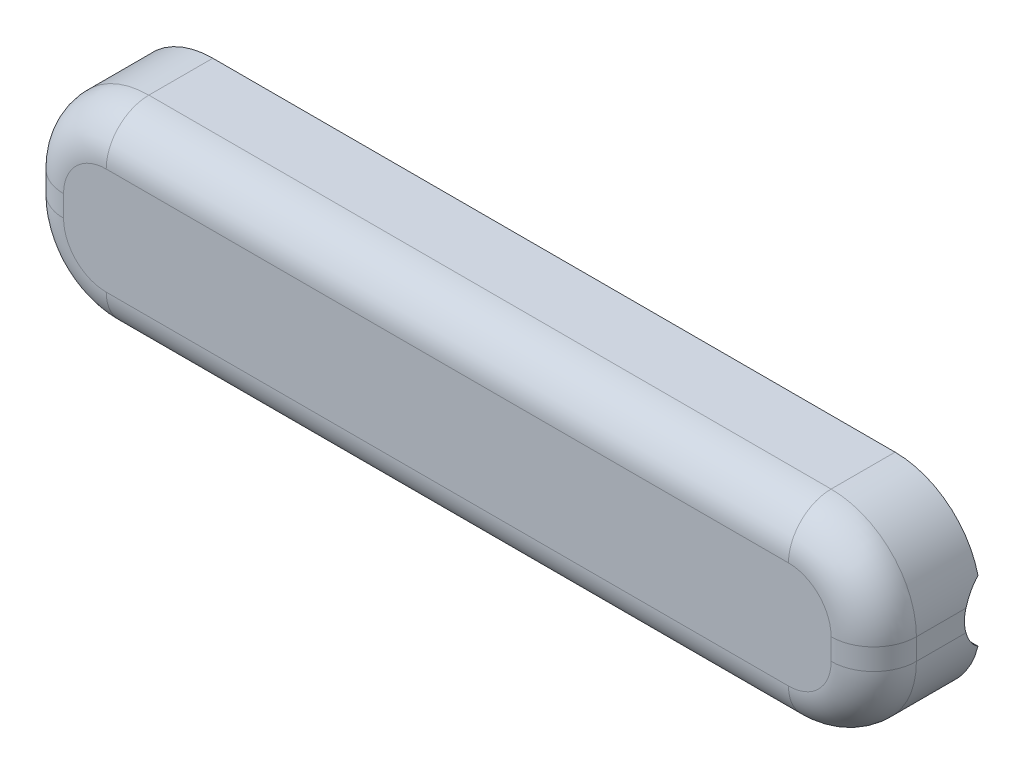
ISO-10303-21;
HEADER;
FILE_DESCRIPTION(('STEP AP214'),'2;1');
FILE_NAME('part.step','',(''),(''),'','','');
FILE_SCHEMA(('AUTOMOTIVE_DESIGN { 1 0 10303 214 1 1 1 1 }'));
ENDSEC;
DATA;
#1=APPLICATION_CONTEXT('core data for automotive mechanical design processes');
#2=APPLICATION_PROTOCOL_DEFINITION('international standard','automotive_design',2000,#1);
#3=PRODUCT_CONTEXT('',#1,'mechanical');
#4=PRODUCT('Part','Part','',(#3));
#5=PRODUCT_RELATED_PRODUCT_CATEGORY('part','',(#4));
#6=PRODUCT_DEFINITION_FORMATION('','',#4);
#7=PRODUCT_DEFINITION_CONTEXT('part definition',#1,'design');
#8=PRODUCT_DEFINITION('design','',#6,#7);
#9=PRODUCT_DEFINITION_SHAPE('','',#8);
#10=(LENGTH_UNIT() NAMED_UNIT(*) SI_UNIT(.MILLI.,.METRE.));
#11=(NAMED_UNIT(*) PLANE_ANGLE_UNIT() SI_UNIT($,.RADIAN.));
#12=(NAMED_UNIT(*) SI_UNIT($,.STERADIAN.) SOLID_ANGLE_UNIT());
#13=UNCERTAINTY_MEASURE_WITH_UNIT(LENGTH_MEASURE(1.E-05),#10,'distance_accuracy_value','');
#14=(GEOMETRIC_REPRESENTATION_CONTEXT(3) GLOBAL_UNCERTAINTY_ASSIGNED_CONTEXT((#13)) GLOBAL_UNIT_ASSIGNED_CONTEXT((#10,
#11,#12)) REPRESENTATION_CONTEXT('',''));
#15=CARTESIAN_POINT('',(0.,0.,0.));
#16=DIRECTION('',(0.,0.,1.));
#17=DIRECTION('',(1.,0.,0.));
#18=AXIS2_PLACEMENT_3D('',#15,#16,#17);
#19=CARTESIAN_POINT('',(0.,0.,0.));
#20=DIRECTION('',(0.,0.,1.));
#21=DIRECTION('',(1.,0.,0.));
#22=AXIS2_PLACEMENT_3D('',#19,#20,#21);
#23=PLANE('',#22);
#24=CARTESIAN_POINT('',(-101.6,-3.175,0.));
#25=DIRECTION('',(0.,0.,1.));
#26=DIRECTION('',(1.,0.,0.));
#27=AXIS2_PLACEMENT_3D('',#24,#25,#26);
#28=CIRCLE('',#27,25.4);
#29=CARTESIAN_POINT('',(-101.6,-28.575,0.));
#30=VERTEX_POINT('',#29);
#31=CARTESIAN_POINT('',(-126.294594561943,-9.11949320137913,0.));
#32=VERTEX_POINT('',#31);
#33=EDGE_CURVE('E268',#30,#32,#28,.F.);
#34=ORIENTED_EDGE('',*,*,#33,.T.);
#35=DIRECTION('',(1.,0.,0.));
#36=VECTOR('',#35,1.);
#37=CARTESIAN_POINT('',(-127.,-9.11949320137913,0.));
#38=LINE('',#37,#36);
#39=CARTESIAN_POINT('',(126.294594561943,-9.11949320137913,0.));
#40=VERTEX_POINT('',#39);
#41=EDGE_CURVE('E190',#32,#40,#38,.T.);
#42=ORIENTED_EDGE('',*,*,#41,.T.);
#43=CARTESIAN_POINT('',(101.6,-3.175,0.));
#44=DIRECTION('',(0.,0.,1.));
#45=DIRECTION('',(1.,0.,0.));
#46=AXIS2_PLACEMENT_3D('',#43,#44,#45);
#47=CIRCLE('',#46,25.4);
#48=CARTESIAN_POINT('',(101.6,-28.575,0.));
#49=VERTEX_POINT('',#48);
#50=EDGE_CURVE('E66',#40,#49,#47,.F.);
#51=ORIENTED_EDGE('',*,*,#50,.T.);
#52=DIRECTION('',(1.,0.,0.));
#53=VECTOR('',#52,1.);
#54=CARTESIAN_POINT('',(-127.,-28.575,0.));
#55=LINE('',#54,#53);
#56=EDGE_CURVE('E328',#30,#49,#55,.T.);
#57=ORIENTED_EDGE('',*,*,#56,.F.);
#58=EDGE_LOOP('',(#34,#42,#51,#57));
#59=FACE_BOUND('',#58,.T.);
#60=ADVANCED_FACE('F38',(#59),#23,.F.);
#61=CARTESIAN_POINT('',(0.,0.,31.75));
#62=DIRECTION('',(0.,0.,1.));
#63=DIRECTION('',(1.,0.,0.));
#64=AXIS2_PLACEMENT_3D('',#61,#62,#63);
#65=PLANE('',#64);
#66=CARTESIAN_POINT('',(-101.6,3.175,31.75));
#67=DIRECTION('',(0.,0.,1.));
#68=DIRECTION('',(1.,0.,0.));
#69=AXIS2_PLACEMENT_3D('',#66,#67,#68);
#70=CIRCLE('',#69,12.7);
#71=CARTESIAN_POINT('',(-114.3,3.175,31.75));
#72=VERTEX_POINT('',#71);
#73=CARTESIAN_POINT('',(-101.6,15.875,31.75));
#74=VERTEX_POINT('',#73);
#75=EDGE_CURVE('E296',#72,#74,#70,.F.);
#76=ORIENTED_EDGE('',*,*,#75,.F.);
#77=DIRECTION('',(0.,-1.,0.));
#78=VECTOR('',#77,1.);
#79=CARTESIAN_POINT('',(-114.3,-28.575,31.75));
#80=LINE('',#79,#78);
#81=CARTESIAN_POINT('',(-114.3,-3.17500000000001,31.75));
#82=VERTEX_POINT('',#81);
#83=EDGE_CURVE('E326',#72,#82,#80,.T.);
#84=ORIENTED_EDGE('',*,*,#83,.T.);
#85=CARTESIAN_POINT('',(-101.6,-3.175,31.75));
#86=DIRECTION('',(0.,0.,1.));
#87=DIRECTION('',(1.,0.,0.));
#88=AXIS2_PLACEMENT_3D('',#85,#86,#87);
#89=CIRCLE('',#88,12.7);
#90=CARTESIAN_POINT('',(-101.6,-15.875,31.75));
#91=VERTEX_POINT('',#90);
#92=EDGE_CURVE('E299',#91,#82,#89,.F.);
#93=ORIENTED_EDGE('',*,*,#92,.F.);
#94=DIRECTION('',(1.,0.,0.));
#95=VECTOR('',#94,1.);
#96=CARTESIAN_POINT('',(127.,-15.875,31.75));
#97=LINE('',#96,#95);
#98=CARTESIAN_POINT('',(101.6,-15.875,31.75));
#99=VERTEX_POINT('',#98);
#100=EDGE_CURVE('E320',#91,#99,#97,.T.);
#101=ORIENTED_EDGE('',*,*,#100,.T.);
#102=CARTESIAN_POINT('',(101.6,-3.175,31.75));
#103=DIRECTION('',(0.,0.,1.));
#104=DIRECTION('',(1.,0.,0.));
#105=AXIS2_PLACEMENT_3D('',#102,#103,#104);
#106=CIRCLE('',#105,12.7);
#107=CARTESIAN_POINT('',(114.3,-3.175,31.75));
#108=VERTEX_POINT('',#107);
#109=EDGE_CURVE('E301',#108,#99,#106,.F.);
#110=ORIENTED_EDGE('',*,*,#109,.F.);
#111=DIRECTION('',(0.,1.,0.));
#112=VECTOR('',#111,1.);
#113=CARTESIAN_POINT('',(114.3,28.575,31.75));
#114=LINE('',#113,#112);
#115=CARTESIAN_POINT('',(114.3,3.175,31.75));
#116=VERTEX_POINT('',#115);
#117=EDGE_CURVE('E317',#108,#116,#114,.T.);
#118=ORIENTED_EDGE('',*,*,#117,.T.);
#119=CARTESIAN_POINT('',(101.6,3.175,31.75));
#120=DIRECTION('',(0.,0.,1.));
#121=DIRECTION('',(1.,0.,0.));
#122=AXIS2_PLACEMENT_3D('',#119,#120,#121);
#123=CIRCLE('',#122,12.7);
#124=CARTESIAN_POINT('',(101.6,15.875,31.75));
#125=VERTEX_POINT('',#124);
#126=EDGE_CURVE('E303',#125,#116,#123,.F.);
#127=ORIENTED_EDGE('',*,*,#126,.F.);
#128=DIRECTION('',(-1.,0.,0.));
#129=VECTOR('',#128,1.);
#130=CARTESIAN_POINT('',(-127.,15.875,31.75));
#131=LINE('',#130,#129);
#132=EDGE_CURVE('E323',#125,#74,#131,.T.);
#133=ORIENTED_EDGE('',*,*,#132,.T.);
#134=EDGE_LOOP('',(#76,#84,#93,#101,#110,#118,#127,#133));
#135=FACE_BOUND('',#134,.T.);
#136=ADVANCED_FACE('F212',(#135),#65,.T.);
#137=CARTESIAN_POINT('',(127.,28.575,31.75));
#138=DIRECTION('',(-1.,0.,0.));
#139=DIRECTION('',(0.,0.,1.));
#140=AXIS2_PLACEMENT_3D('',#137,#138,#139);
#141=PLANE('',#140);
#142=DIRECTION('',(0.,0.,-1.));
#143=VECTOR('',#142,1.);
#144=CARTESIAN_POINT('',(127.,-3.175,31.75));
#145=LINE('',#144,#143);
#146=CARTESIAN_POINT('',(127.,-3.175,19.05));
#147=VERTEX_POINT('',#146);
#148=CARTESIAN_POINT('',(127.,-3.175,4.29927374284275));
#149=VERTEX_POINT('',#148);
#150=EDGE_CURVE('E158',#147,#149,#145,.T.);
#151=ORIENTED_EDGE('',*,*,#150,.T.);
#152=CARTESIAN_POINT('',(127.,0.,-6.35));
#153=DIRECTION('',(1.,0.,0.));
#154=DIRECTION('',(0.,0.,-1.));
#155=AXIS2_PLACEMENT_3D('',#152,#153,#154);
#156=CIRCLE('',#155,11.1125);
#157=CARTESIAN_POINT('',(127.,3.175,4.29927374284275));
#158=VERTEX_POINT('',#157);
#159=EDGE_CURVE('E145',#158,#149,#156,.T.);
#160=ORIENTED_EDGE('',*,*,#159,.F.);
#161=DIRECTION('',(0.,0.,-1.));
#162=VECTOR('',#161,1.);
#163=CARTESIAN_POINT('',(127.,3.175,31.75));
#164=LINE('',#163,#162);
#165=CARTESIAN_POINT('',(127.,3.175,19.05));
#166=VERTEX_POINT('',#165);
#167=EDGE_CURVE('E155',#158,#166,#164,.F.);
#168=ORIENTED_EDGE('',*,*,#167,.T.);
#169=DIRECTION('',(0.,1.,0.));
#170=VECTOR('',#169,1.);
#171=CARTESIAN_POINT('',(127.,-28.575,19.05));
#172=LINE('',#171,#170);
#173=EDGE_CURVE('E315',#166,#147,#172,.F.);
#174=ORIENTED_EDGE('',*,*,#173,.T.);
#175=EDGE_LOOP('',(#151,#160,#168,#174));
#176=FACE_BOUND('',#175,.T.);
#177=ADVANCED_FACE('F153',(#176),#141,.F.);
#178=CARTESIAN_POINT('',(-127.,28.575,31.75));
#179=DIRECTION('',(0.,-1.,0.));
#180=DIRECTION('',(0.,0.,-1.));
#181=AXIS2_PLACEMENT_3D('',#178,#179,#180);
#182=PLANE('',#181);
#183=DIRECTION('',(-1.,0.,0.));
#184=VECTOR('',#183,1.);
#185=CARTESIAN_POINT('',(127.,28.575,19.05));
#186=LINE('',#185,#184);
#187=CARTESIAN_POINT('',(-101.6,28.575,19.05));
#188=VERTEX_POINT('',#187);
#189=CARTESIAN_POINT('',(101.6,28.575,19.05));
#190=VERTEX_POINT('',#189);
#191=EDGE_CURVE('E309',#188,#190,#186,.F.);
#192=ORIENTED_EDGE('',*,*,#191,.T.);
#193=DIRECTION('',(0.,0.,-1.));
#194=VECTOR('',#193,1.);
#195=CARTESIAN_POINT('',(101.6,28.575,31.75));
#196=LINE('',#195,#194);
#197=CARTESIAN_POINT('',(101.6,28.575,0.));
#198=VERTEX_POINT('',#197);
#199=EDGE_CURVE('E274',#190,#198,#196,.T.);
#200=ORIENTED_EDGE('',*,*,#199,.T.);
#201=DIRECTION('',(-1.,0.,0.));
#202=VECTOR('',#201,1.);
#203=CARTESIAN_POINT('',(-127.,28.575,0.));
#204=LINE('',#203,#202);
#205=CARTESIAN_POINT('',(-101.6,28.575,0.));
#206=VERTEX_POINT('',#205);
#207=EDGE_CURVE('E182',#198,#206,#204,.T.);
#208=ORIENTED_EDGE('',*,*,#207,.T.);
#209=DIRECTION('',(0.,0.,-1.));
#210=VECTOR('',#209,1.);
#211=CARTESIAN_POINT('',(-101.6,28.575,31.75));
#212=LINE('',#211,#210);
#213=EDGE_CURVE('E276',#206,#188,#212,.F.);
#214=ORIENTED_EDGE('',*,*,#213,.T.);
#215=EDGE_LOOP('',(#192,#200,#208,#214));
#216=FACE_BOUND('',#215,.T.);
#217=ADVANCED_FACE('F332',(#216),#182,.F.);
#218=CARTESIAN_POINT('',(-127.,28.575,31.75));
#219=DIRECTION('',(1.,0.,0.));
#220=DIRECTION('',(0.,1.,0.));
#221=AXIS2_PLACEMENT_3D('',#218,#219,#220);
#222=PLANE('',#221);
#223=DIRECTION('',(0.,0.,-1.));
#224=VECTOR('',#223,1.);
#225=CARTESIAN_POINT('',(-127.,3.17499999999999,31.75));
#226=LINE('',#225,#224);
#227=CARTESIAN_POINT('',(-127.,3.17499999999999,19.05));
#228=VERTEX_POINT('',#227);
#229=CARTESIAN_POINT('',(-127.,3.175,4.29927374284275));
#230=VERTEX_POINT('',#229);
#231=EDGE_CURVE('E175',#228,#230,#226,.T.);
#232=ORIENTED_EDGE('',*,*,#231,.T.);
#233=CARTESIAN_POINT('',(-127.,0.,-6.35));
#234=DIRECTION('',(1.,0.,0.));
#235=DIRECTION('',(0.,0.,-1.));
#236=AXIS2_PLACEMENT_3D('',#233,#234,#235);
#237=CIRCLE('',#236,11.1125);
#238=CARTESIAN_POINT('',(-127.,-3.175,4.29927374284275));
#239=VERTEX_POINT('',#238);
#240=EDGE_CURVE('E159',#230,#239,#237,.T.);
#241=ORIENTED_EDGE('',*,*,#240,.T.);
#242=DIRECTION('',(0.,0.,-1.));
#243=VECTOR('',#242,1.);
#244=CARTESIAN_POINT('',(-127.,-3.17500000000002,31.75));
#245=LINE('',#244,#243);
#246=CARTESIAN_POINT('',(-127.,-3.17500000000002,19.05));
#247=VERTEX_POINT('',#246);
#248=EDGE_CURVE('E52',#239,#247,#245,.F.);
#249=ORIENTED_EDGE('',*,*,#248,.T.);
#250=DIRECTION('',(0.,-1.,0.));
#251=VECTOR('',#250,1.);
#252=CARTESIAN_POINT('',(-127.,28.575,19.05));
#253=LINE('',#252,#251);
#254=EDGE_CURVE('E306',#247,#228,#253,.F.);
#255=ORIENTED_EDGE('',*,*,#254,.T.);
#256=EDGE_LOOP('',(#232,#241,#249,#255));
#257=FACE_BOUND('',#256,.T.);
#258=ADVANCED_FACE('F263',(#257),#222,.F.);
#259=CARTESIAN_POINT('',(-127.,-28.575,31.75));
#260=DIRECTION('',(0.,1.,0.));
#261=DIRECTION('',(0.,0.,1.));
#262=AXIS2_PLACEMENT_3D('',#259,#260,#261);
#263=PLANE('',#262);
#264=ORIENTED_EDGE('',*,*,#56,.T.);
#265=DIRECTION('',(0.,0.,-1.));
#266=VECTOR('',#265,1.);
#267=CARTESIAN_POINT('',(101.6,-28.575,31.75));
#268=LINE('',#267,#266);
#269=CARTESIAN_POINT('',(101.6,-28.575,19.05));
#270=VERTEX_POINT('',#269);
#271=EDGE_CURVE('E168',#49,#270,#268,.F.);
#272=ORIENTED_EDGE('',*,*,#271,.T.);
#273=DIRECTION('',(1.,0.,0.));
#274=VECTOR('',#273,1.);
#275=CARTESIAN_POINT('',(-127.,-28.575,19.05));
#276=LINE('',#275,#274);
#277=CARTESIAN_POINT('',(-101.6,-28.575,19.05));
#278=VERTEX_POINT('',#277);
#279=EDGE_CURVE('E312',#270,#278,#276,.F.);
#280=ORIENTED_EDGE('',*,*,#279,.T.);
#281=DIRECTION('',(0.,0.,-1.));
#282=VECTOR('',#281,1.);
#283=CARTESIAN_POINT('',(-101.6,-28.575,31.75));
#284=LINE('',#283,#282);
#285=EDGE_CURVE('E166',#278,#30,#284,.T.);
#286=ORIENTED_EDGE('',*,*,#285,.T.);
#287=EDGE_LOOP('',(#264,#272,#280,#286));
#288=FACE_BOUND('',#287,.T.);
#289=ADVANCED_FACE('F252',(#288),#263,.F.);
#290=CARTESIAN_POINT('',(101.6,3.175,0.));
#291=DIRECTION('',(0.,0.,1.));
#292=DIRECTION('',(1.,0.,0.));
#293=AXIS2_PLACEMENT_3D('',#290,#291,#292);
#294=CIRCLE('',#293,25.4);
#295=CARTESIAN_POINT('',(126.294594561943,9.11949320137913,0.));
#296=VERTEX_POINT('',#295);
#297=EDGE_CURVE('E170',#198,#296,#294,.F.);
#298=ORIENTED_EDGE('',*,*,#297,.T.);
#299=DIRECTION('',(1.,0.,0.));
#300=VECTOR('',#299,1.);
#301=CARTESIAN_POINT('',(-127.,9.11949320137913,0.));
#302=LINE('',#301,#300);
#303=CARTESIAN_POINT('',(-126.294594561943,9.11949320137913,0.));
#304=VERTEX_POINT('',#303);
#305=EDGE_CURVE('E58',#296,#304,#302,.F.);
#306=ORIENTED_EDGE('',*,*,#305,.T.);
#307=CARTESIAN_POINT('',(-101.6,3.175,0.));
#308=DIRECTION('',(0.,0.,1.));
#309=DIRECTION('',(1.,0.,0.));
#310=AXIS2_PLACEMENT_3D('',#307,#308,#309);
#311=CIRCLE('',#310,25.4);
#312=EDGE_CURVE('E272',#304,#206,#311,.F.);
#313=ORIENTED_EDGE('',*,*,#312,.T.);
#314=ORIENTED_EDGE('',*,*,#207,.F.);
#315=EDGE_LOOP('',(#298,#306,#313,#314));
#316=FACE_BOUND('',#315,.T.);
#317=ADVANCED_FACE('F242',(#316),#23,.F.);
#318=CARTESIAN_POINT('',(-114.3,0.,19.05));
#319=DIRECTION('',(0.,1.,0.));
#320=DIRECTION('',(-1.,0.,0.));
#321=AXIS2_PLACEMENT_3D('',#318,#319,#320);
#322=CYLINDRICAL_SURFACE('',#321,12.7);
#323=ORIENTED_EDGE('',*,*,#254,.F.);
#324=CARTESIAN_POINT('',(-114.3,-3.17500000000001,19.05));
#325=DIRECTION('',(0.,1.,0.));
#326=DIRECTION('',(-1.,0.,0.));
#327=AXIS2_PLACEMENT_3D('',#324,#325,#326);
#328=CIRCLE('',#327,12.7);
#329=EDGE_CURVE('E287',#247,#82,#328,.T.);
#330=ORIENTED_EDGE('',*,*,#329,.T.);
#331=ORIENTED_EDGE('',*,*,#83,.F.);
#332=CARTESIAN_POINT('',(-114.3,3.175,19.05));
#333=DIRECTION('',(0.,-1.,0.));
#334=DIRECTION('',(1.,0.,0.));
#335=AXIS2_PLACEMENT_3D('',#332,#333,#334);
#336=CIRCLE('',#335,12.7);
#337=EDGE_CURVE('E290',#72,#228,#336,.T.);
#338=ORIENTED_EDGE('',*,*,#337,.T.);
#339=EDGE_LOOP('',(#323,#330,#331,#338));
#340=FACE_BOUND('',#339,.T.);
#341=ADVANCED_FACE('F251',(#340),#322,.T.);
#342=CARTESIAN_POINT('',(0.,-15.875,19.05));
#343=DIRECTION('',(-1.,0.,0.));
#344=DIRECTION('',(0.,0.,1.));
#345=AXIS2_PLACEMENT_3D('',#342,#343,#344);
#346=CYLINDRICAL_SURFACE('',#345,12.7);
#347=ORIENTED_EDGE('',*,*,#279,.F.);
#348=CARTESIAN_POINT('',(101.6,-15.875,19.05));
#349=DIRECTION('',(-1.,0.,0.));
#350=DIRECTION('',(0.,0.,1.));
#351=AXIS2_PLACEMENT_3D('',#348,#349,#350);
#352=CIRCLE('',#351,12.7);
#353=EDGE_CURVE('E282',#270,#99,#352,.T.);
#354=ORIENTED_EDGE('',*,*,#353,.T.);
#355=ORIENTED_EDGE('',*,*,#100,.F.);
#356=CARTESIAN_POINT('',(-101.6,-15.875,19.05));
#357=DIRECTION('',(1.,0.,0.));
#358=DIRECTION('',(0.,0.,-1.));
#359=AXIS2_PLACEMENT_3D('',#356,#357,#358);
#360=CIRCLE('',#359,12.7);
#361=EDGE_CURVE('E285',#91,#278,#360,.T.);
#362=ORIENTED_EDGE('',*,*,#361,.T.);
#363=EDGE_LOOP('',(#347,#354,#355,#362));
#364=FACE_BOUND('',#363,.T.);
#365=ADVANCED_FACE('F259',(#364),#346,.T.);
#366=CARTESIAN_POINT('',(0.,15.875,19.05));
#367=DIRECTION('',(1.,0.,0.));
#368=DIRECTION('',(0.,0.,-1.));
#369=AXIS2_PLACEMENT_3D('',#366,#367,#368);
#370=CYLINDRICAL_SURFACE('',#369,12.7);
#371=ORIENTED_EDGE('',*,*,#191,.F.);
#372=CARTESIAN_POINT('',(-101.6,15.875,19.05));
#373=DIRECTION('',(1.,0.,0.));
#374=DIRECTION('',(0.,0.,-1.));
#375=AXIS2_PLACEMENT_3D('',#372,#373,#374);
#376=CIRCLE('',#375,12.7);
#377=EDGE_CURVE('E292',#188,#74,#376,.T.);
#378=ORIENTED_EDGE('',*,*,#377,.T.);
#379=ORIENTED_EDGE('',*,*,#132,.F.);
#380=CARTESIAN_POINT('',(101.6,15.875,19.05));
#381=DIRECTION('',(-1.,0.,0.));
#382=DIRECTION('',(0.,0.,1.));
#383=AXIS2_PLACEMENT_3D('',#380,#381,#382);
#384=CIRCLE('',#383,12.7);
#385=EDGE_CURVE('E294',#125,#190,#384,.T.);
#386=ORIENTED_EDGE('',*,*,#385,.T.);
#387=EDGE_LOOP('',(#371,#378,#379,#386));
#388=FACE_BOUND('',#387,.T.);
#389=ADVANCED_FACE('F345',(#388),#370,.T.);
#390=CARTESIAN_POINT('',(114.3,0.,19.05));
#391=DIRECTION('',(0.,-1.,0.));
#392=DIRECTION('',(0.,0.,-1.));
#393=AXIS2_PLACEMENT_3D('',#390,#391,#392);
#394=CYLINDRICAL_SURFACE('',#393,12.7);
#395=ORIENTED_EDGE('',*,*,#173,.F.);
#396=CARTESIAN_POINT('',(114.3,3.175,19.05));
#397=DIRECTION('',(0.,-1.,0.));
#398=DIRECTION('',(0.,0.,-1.));
#399=AXIS2_PLACEMENT_3D('',#396,#397,#398);
#400=CIRCLE('',#399,12.7);
#401=EDGE_CURVE('E278',#166,#116,#400,.T.);
#402=ORIENTED_EDGE('',*,*,#401,.T.);
#403=ORIENTED_EDGE('',*,*,#117,.F.);
#404=CARTESIAN_POINT('',(114.3,-3.175,19.05));
#405=DIRECTION('',(0.,1.,0.));
#406=DIRECTION('',(0.,0.,1.));
#407=AXIS2_PLACEMENT_3D('',#404,#405,#406);
#408=CIRCLE('',#407,12.7);
#409=EDGE_CURVE('E280',#108,#147,#408,.T.);
#410=ORIENTED_EDGE('',*,*,#409,.T.);
#411=EDGE_LOOP('',(#395,#402,#403,#410));
#412=FACE_BOUND('',#411,.T.);
#413=ADVANCED_FACE('F350',(#412),#394,.T.);
#414=CARTESIAN_POINT('',(-101.6,3.175,31.75));
#415=DIRECTION('',(0.,0.,-1.));
#416=DIRECTION('',(-1.,0.,0.));
#417=AXIS2_PLACEMENT_3D('',#414,#415,#416);
#418=CYLINDRICAL_SURFACE('',#417,25.4);
#419=CARTESIAN_POINT('',(-127.,3.17499999999998,4.29927374284276));
#420=CARTESIAN_POINT('',(-127.000001518759,3.32295952546643,4.25516128731026));
#421=CARTESIAN_POINT('',(-126.998706794131,3.46997763715196,4.20797009075268));
#422=CARTESIAN_POINT('',(-126.993638413473,3.76187740341818,4.10752175864079));
#423=CARTESIAN_POINT('',(-126.98986485379,3.90675914081246,4.05426485891689));
#424=CARTESIAN_POINT('',(-126.975003082216,4.3376336511402,3.88560681579487));
#425=CARTESIAN_POINT('',(-126.960373457098,4.62006531796743,3.76125578858416));
#426=CARTESIAN_POINT('',(-126.92332243909,5.16548780475589,3.49353422786026));
#427=CARTESIAN_POINT('',(-126.901127116511,5.42879999012849,3.35078297688706));
#428=CARTESIAN_POINT('',(-126.850089580176,5.94260324913692,3.04481372417006));
#429=CARTESIAN_POINT('',(-126.821246798909,6.19309322587541,2.88159397552102));
#430=CARTESIAN_POINT('',(-126.756456600613,6.69351105317577,2.52603819734506));
#431=CARTESIAN_POINT('',(-126.720198533894,6.94259761967255,2.33257450700391));
#432=CARTESIAN_POINT('',(-126.643421827821,7.42308651910052,1.92554284813852));
#433=CARTESIAN_POINT('',(-126.602902692229,7.6544867868766,1.7119725383265));
#434=CARTESIAN_POINT('',(-126.518086887196,8.1048089320685,1.25950827976725));
#435=CARTESIAN_POINT('',(-126.473713166881,8.32314441551093,1.0200450471346));
#436=CARTESIAN_POINT('',(-126.384227286367,8.73801565133919,0.523109172972507));
#437=CARTESIAN_POINT('',(-126.339115226433,8.93455433591565,0.265638961429456));
#438=CARTESIAN_POINT('',(-126.294594561943,9.11949320137913,0.));
#439=B_SPLINE_CURVE_WITH_KNOTS('',3,(#419,#420,#421,#422,#423,#424,#425,#426,#427,#428,#429,
#430,#431,#432,#433,#434,#435,#436,#437,#438),.UNSPECIFIED.,.F.,.F.,(4,2,2,2,2,2,2,2,2,4),(0.,
0.463103258765995,0.926188518535177,1.85170520116634,2.75169126454189,3.65175419050592,
4.60297834845972,5.55431340773126,6.53432482842746,7.51420425383056),.UNSPECIFIED.);
#440=EDGE_CURVE('E218',#230,#304,#439,.T.);
#441=ORIENTED_EDGE('',*,*,#440,.F.);
#442=ORIENTED_EDGE('',*,*,#231,.F.);
#443=CARTESIAN_POINT('',(-101.6,3.175,19.05));
#444=DIRECTION('',(0.,0.,1.));
#445=DIRECTION('',(1.,0.,0.));
#446=AXIS2_PLACEMENT_3D('',#443,#444,#445);
#447=CIRCLE('',#446,25.4);
#448=EDGE_CURVE('E179',#188,#228,#447,.T.);
#449=ORIENTED_EDGE('',*,*,#448,.F.);
#450=ORIENTED_EDGE('',*,*,#213,.F.);
#451=ORIENTED_EDGE('',*,*,#312,.F.);
#452=EDGE_LOOP('',(#441,#442,#449,#450,#451));
#453=FACE_BOUND('',#452,.T.);
#454=ADVANCED_FACE('F337',(#453),#418,.T.);
#455=CARTESIAN_POINT('',(-101.6,3.175,19.05));
#456=DIRECTION('',(0.,0.,1.));
#457=DIRECTION('',(1.,0.,0.));
#458=AXIS2_PLACEMENT_3D('',#455,#456,#457);
#459=DEGENERATE_TOROIDAL_SURFACE('',#458,12.7,12.7,.T.);
#460=ORIENTED_EDGE('',*,*,#337,.F.);
#461=ORIENTED_EDGE('',*,*,#75,.T.);
#462=ORIENTED_EDGE('',*,*,#377,.F.);
#463=ORIENTED_EDGE('',*,*,#448,.T.);
#464=EDGE_LOOP('',(#460,#461,#462,#463));
#465=FACE_BOUND('',#464,.T.);
#466=ADVANCED_FACE('F341',(#465),#459,.T.);
#467=CARTESIAN_POINT('',(-101.6,-3.175,31.75));
#468=DIRECTION('',(0.,0.,-1.));
#469=DIRECTION('',(-1.,0.,0.));
#470=AXIS2_PLACEMENT_3D('',#467,#468,#469);
#471=CYLINDRICAL_SURFACE('',#470,25.4);
#472=CARTESIAN_POINT('',(-126.294594561943,-9.11949320137913,0.));
#473=CARTESIAN_POINT('',(-126.337721615333,-8.94034133075989,0.257322695166812));
#474=CARTESIAN_POINT('',(-126.381403523024,-8.75030774678587,0.506980732429077));
#475=CARTESIAN_POINT('',(-126.468128211311,-8.34976195458216,0.989435758836131));
#476=CARTESIAN_POINT('',(-126.511170951155,-8.13924844701402,1.22223167653548));
#477=CARTESIAN_POINT('',(-126.59367646078,-7.70528921786131,1.66306038020032));
#478=CARTESIAN_POINT('',(-126.633206121708,-7.48237917525837,1.87160803078978));
#479=CARTESIAN_POINT('',(-126.708414660892,-7.01979018643433,2.2699390717348));
#480=CARTESIAN_POINT('',(-126.744093790614,-6.7801123369481,2.45972368737171));
#481=CARTESIAN_POINT('',(-126.810307187861,-6.2836276854666,2.82052454257086));
#482=CARTESIAN_POINT('',(-126.840802134048,-6.02670894550476,2.99139418204446));
#483=CARTESIAN_POINT('',(-126.894846244244,-5.49902704035173,3.31144863116));
#484=CARTESIAN_POINT('',(-126.918395727132,-5.22826451142557,3.46063443618915));
#485=CARTESIAN_POINT('',(-126.957771751523,-4.66660660970688,3.74017531941906));
#486=CARTESIAN_POINT('',(-126.973352308412,-4.37535403356738,3.86985214117903));
#487=CARTESIAN_POINT('',(-126.989189877262,-3.93070868321832,4.04531765644551));
#488=CARTESIAN_POINT('',(-126.993213612528,-3.78114424368472,4.10064759365111));
#489=CARTESIAN_POINT('',(-126.998619617934,-3.47972187737654,4.20483855096297));
#490=CARTESIAN_POINT('',(-127.000001724882,-3.32786380949172,4.25369917123839));
#491=CARTESIAN_POINT('',(-127.,-3.17500000000001,4.29927374284275));
#492=B_SPLINE_CURVE_WITH_KNOTS('',3,(#472,#473,#474,#475,#476,#477,#478,#479,#480,#481,#482,
#483,#484,#485,#486,#487,#488,#489,#490,#491),.UNSPECIFIED.,.F.,.F.,(4,2,2,2,2,2,2,2,2,4),(0.,
0.949222789556298,1.89850584139777,2.82088220543792,3.74319829574759,4.67222490746955,
5.6012088591421,6.5573595200369,7.0357773465974,7.51422472759282),.UNSPECIFIED.);
#493=EDGE_CURVE('E188',#32,#239,#492,.T.);
#494=ORIENTED_EDGE('',*,*,#493,.F.);
#495=ORIENTED_EDGE('',*,*,#33,.F.);
#496=ORIENTED_EDGE('',*,*,#285,.F.);
#497=CARTESIAN_POINT('',(-101.6,-3.175,19.05));
#498=DIRECTION('',(0.,0.,1.));
#499=DIRECTION('',(1.,0.,0.));
#500=AXIS2_PLACEMENT_3D('',#497,#498,#499);
#501=CIRCLE('',#500,25.4);
#502=EDGE_CURVE('E183',#247,#278,#501,.T.);
#503=ORIENTED_EDGE('',*,*,#502,.F.);
#504=ORIENTED_EDGE('',*,*,#248,.F.);
#505=EDGE_LOOP('',(#494,#495,#496,#503,#504));
#506=FACE_BOUND('',#505,.T.);
#507=ADVANCED_FACE('F204',(#506),#471,.T.);
#508=CARTESIAN_POINT('',(-101.6,-3.175,19.05));
#509=DIRECTION('',(0.,0.,1.));
#510=DIRECTION('',(1.,0.,0.));
#511=AXIS2_PLACEMENT_3D('',#508,#509,#510);
#512=DEGENERATE_TOROIDAL_SURFACE('',#511,12.7,12.7,.T.);
#513=ORIENTED_EDGE('',*,*,#329,.F.);
#514=ORIENTED_EDGE('',*,*,#502,.T.);
#515=ORIENTED_EDGE('',*,*,#361,.F.);
#516=ORIENTED_EDGE('',*,*,#92,.T.);
#517=EDGE_LOOP('',(#513,#514,#515,#516));
#518=FACE_BOUND('',#517,.T.);
#519=ADVANCED_FACE('F234',(#518),#512,.T.);
#520=CARTESIAN_POINT('',(101.6,-3.175,31.75));
#521=DIRECTION('',(0.,0.,-1.));
#522=DIRECTION('',(-1.,0.,0.));
#523=AXIS2_PLACEMENT_3D('',#520,#521,#522);
#524=CYLINDRICAL_SURFACE('',#523,25.4);
#525=CARTESIAN_POINT('',(127.,-3.17499999999999,4.29927374284275));
#526=CARTESIAN_POINT('',(127.000001518759,-3.32295952546644,4.25516128731026));
#527=CARTESIAN_POINT('',(126.998706794131,-3.46997763715196,4.20797009075268));
#528=CARTESIAN_POINT('',(126.993638413473,-3.76187740341819,4.10752175864079));
#529=CARTESIAN_POINT('',(126.98986485379,-3.90675914081247,4.05426485891689));
#530=CARTESIAN_POINT('',(126.975003082216,-4.33763365114021,3.88560681579487));
#531=CARTESIAN_POINT('',(126.960373457098,-4.62006531796743,3.76125578858415));
#532=CARTESIAN_POINT('',(126.92332243909,-5.16548780475589,3.49353422786025));
#533=CARTESIAN_POINT('',(126.901127116511,-5.4287999901285,3.35078297688705));
#534=CARTESIAN_POINT('',(126.850089580176,-5.94260324913693,3.04481372417006));
#535=CARTESIAN_POINT('',(126.821246798909,-6.19309322587542,2.88159397552102));
#536=CARTESIAN_POINT('',(126.756456600613,-6.69351105317577,2.52603819734506));
#537=CARTESIAN_POINT('',(126.720198533894,-6.94259761967255,2.3325745070039));
#538=CARTESIAN_POINT('',(126.643421827821,-7.42308651910052,1.92554284813852));
#539=CARTESIAN_POINT('',(126.602902692229,-7.6544867868766,1.7119725383265));
#540=CARTESIAN_POINT('',(126.518086887196,-8.1048089320685,1.25950827976725));
#541=CARTESIAN_POINT('',(126.473713166881,-8.32314441551093,1.0200450471346));
#542=CARTESIAN_POINT('',(126.384227286367,-8.73801565133919,0.523109172972508));
#543=CARTESIAN_POINT('',(126.339115226433,-8.93455433591565,0.265638961429456));
#544=CARTESIAN_POINT('',(126.294594561943,-9.11949320137913,0.));
#545=B_SPLINE_CURVE_WITH_KNOTS('',3,(#525,#526,#527,#528,#529,#530,#531,#532,#533,#534,#535,
#536,#537,#538,#539,#540,#541,#542,#543,#544),.UNSPECIFIED.,.F.,.F.,(4,2,2,2,2,2,2,2,2,4),(0.,
0.463103258765994,0.926188518535175,1.85170520116634,2.75169126454189,3.65175419050592,
4.60297834845972,5.55431340773125,6.53432482842744,7.51420425383055),.UNSPECIFIED.);
#546=EDGE_CURVE('E194',#149,#40,#545,.T.);
#547=ORIENTED_EDGE('',*,*,#546,.F.);
#548=ORIENTED_EDGE('',*,*,#150,.F.);
#549=CARTESIAN_POINT('',(101.6,-3.175,19.05));
#550=DIRECTION('',(0.,0.,1.));
#551=DIRECTION('',(1.,0.,0.));
#552=AXIS2_PLACEMENT_3D('',#549,#550,#551);
#553=CIRCLE('',#552,25.4);
#554=EDGE_CURVE('E186',#270,#147,#553,.T.);
#555=ORIENTED_EDGE('',*,*,#554,.F.);
#556=ORIENTED_EDGE('',*,*,#271,.F.);
#557=ORIENTED_EDGE('',*,*,#50,.F.);
#558=EDGE_LOOP('',(#547,#548,#555,#556,#557));
#559=FACE_BOUND('',#558,.T.);
#560=ADVANCED_FACE('F230',(#559),#524,.T.);
#561=CARTESIAN_POINT('',(101.6,-3.175,19.05));
#562=DIRECTION('',(0.,0.,1.));
#563=DIRECTION('',(1.,0.,0.));
#564=AXIS2_PLACEMENT_3D('',#561,#562,#563);
#565=DEGENERATE_TOROIDAL_SURFACE('',#564,12.7,12.7,.T.);
#566=ORIENTED_EDGE('',*,*,#353,.F.);
#567=ORIENTED_EDGE('',*,*,#554,.T.);
#568=ORIENTED_EDGE('',*,*,#409,.F.);
#569=ORIENTED_EDGE('',*,*,#109,.T.);
#570=EDGE_LOOP('',(#566,#567,#568,#569));
#571=FACE_BOUND('',#570,.T.);
#572=ADVANCED_FACE('F233',(#571),#565,.T.);
#573=CARTESIAN_POINT('',(101.6,3.175,31.75));
#574=DIRECTION('',(0.,0.,-1.));
#575=DIRECTION('',(-1.,0.,0.));
#576=AXIS2_PLACEMENT_3D('',#573,#574,#575);
#577=CYLINDRICAL_SURFACE('',#576,25.4);
#578=CARTESIAN_POINT('',(126.294594561943,9.11949320137913,0.));
#579=CARTESIAN_POINT('',(126.337721615333,8.94034133075989,0.257322695166811));
#580=CARTESIAN_POINT('',(126.381403523024,8.75030774678587,0.506980732429075));
#581=CARTESIAN_POINT('',(126.468128211312,8.34976195458216,0.989435758836128));
#582=CARTESIAN_POINT('',(126.511170951155,8.13924844701403,1.22223167653547));
#583=CARTESIAN_POINT('',(126.593676460781,7.70528921786131,1.66306038020032));
#584=CARTESIAN_POINT('',(126.633206121708,7.48237917525838,1.87160803078978));
#585=CARTESIAN_POINT('',(126.708414660892,7.01979018643433,2.2699390717348));
#586=CARTESIAN_POINT('',(126.744093790614,6.78011233694811,2.45972368737171));
#587=CARTESIAN_POINT('',(126.810307187861,6.28362768546661,2.82052454257086));
#588=CARTESIAN_POINT('',(126.840802134048,6.02670894550477,2.99139418204445));
#589=CARTESIAN_POINT('',(126.894846244244,5.49902704035173,3.31144863116));
#590=CARTESIAN_POINT('',(126.918395727132,5.22826451142557,3.46063443618915));
#591=CARTESIAN_POINT('',(126.957771751523,4.66660660970688,3.74017531941906));
#592=CARTESIAN_POINT('',(126.973352308412,4.37535403356738,3.86985214117903));
#593=CARTESIAN_POINT('',(126.989189877262,3.93070868321832,4.04531765644551));
#594=CARTESIAN_POINT('',(126.993213612528,3.78114424368472,4.10064759365111));
#595=CARTESIAN_POINT('',(126.998619617935,3.47972187737654,4.20483855096297));
#596=CARTESIAN_POINT('',(127.000001724882,3.32786380949172,4.25369917123839));
#597=CARTESIAN_POINT('',(127.,3.17500000000001,4.29927374284275));
#598=B_SPLINE_CURVE_WITH_KNOTS('',3,(#578,#579,#580,#581,#582,#583,#584,#585,#586,#587,#588,
#589,#590,#591,#592,#593,#594,#595,#596,#597),.UNSPECIFIED.,.F.,.F.,(4,2,2,2,2,2,2,2,2,4),(0.,
0.94922278955629,1.89850584139776,2.82088220543791,3.74319829574758,4.67222490746954,
5.6012088591421,6.5573595200369,7.03577734659739,7.51422472759282),.UNSPECIFIED.);
#599=EDGE_CURVE('E11',#296,#158,#598,.T.);
#600=ORIENTED_EDGE('',*,*,#599,.F.);
#601=ORIENTED_EDGE('',*,*,#297,.F.);
#602=ORIENTED_EDGE('',*,*,#199,.F.);
#603=CARTESIAN_POINT('',(101.6,3.175,19.05));
#604=DIRECTION('',(0.,0.,1.));
#605=DIRECTION('',(1.,0.,0.));
#606=AXIS2_PLACEMENT_3D('',#603,#604,#605);
#607=CIRCLE('',#606,25.4);
#608=EDGE_CURVE('E164',#166,#190,#607,.T.);
#609=ORIENTED_EDGE('',*,*,#608,.F.);
#610=ORIENTED_EDGE('',*,*,#167,.F.);
#611=EDGE_LOOP('',(#600,#601,#602,#609,#610));
#612=FACE_BOUND('',#611,.T.);
#613=ADVANCED_FACE('F40',(#612),#577,.T.);
#614=CARTESIAN_POINT('',(101.6,3.175,19.05));
#615=DIRECTION('',(0.,0.,1.));
#616=DIRECTION('',(1.,0.,0.));
#617=AXIS2_PLACEMENT_3D('',#614,#615,#616);
#618=DEGENERATE_TOROIDAL_SURFACE('',#617,12.7,12.7,.T.);
#619=ORIENTED_EDGE('',*,*,#385,.F.);
#620=ORIENTED_EDGE('',*,*,#126,.T.);
#621=ORIENTED_EDGE('',*,*,#401,.F.);
#622=ORIENTED_EDGE('',*,*,#608,.T.);
#623=EDGE_LOOP('',(#619,#620,#621,#622));
#624=FACE_BOUND('',#623,.T.);
#625=ADVANCED_FACE('F211',(#624),#618,.T.);
#626=CARTESIAN_POINT('',(-127.,0.,-6.35));
#627=DIRECTION('',(1.,0.,0.));
#628=DIRECTION('',(0.,0.,-1.));
#629=AXIS2_PLACEMENT_3D('',#626,#627,#628);
#630=CYLINDRICAL_SURFACE('',#629,11.1125);
#631=ORIENTED_EDGE('',*,*,#493,.T.);
#632=ORIENTED_EDGE('',*,*,#240,.F.);
#633=ORIENTED_EDGE('',*,*,#440,.T.);
#634=ORIENTED_EDGE('',*,*,#305,.F.);
#635=ORIENTED_EDGE('',*,*,#599,.T.);
#636=ORIENTED_EDGE('',*,*,#159,.T.);
#637=ORIENTED_EDGE('',*,*,#546,.T.);
#638=ORIENTED_EDGE('',*,*,#41,.F.);
#639=EDGE_LOOP('',(#631,#632,#633,#634,#635,#636,#637,#638));
#640=FACE_BOUND('',#639,.T.);
#641=ADVANCED_FACE('F144',(#640),#630,.F.);
#642=CLOSED_SHELL('',(#60,#136,#177,#217,#258,#289,#317,#341,#365,#389,#413,#454,#466,#507,#519,
#560,#572,#613,#625,#641));
#643=MANIFOLD_SOLID_BREP('B2',#642);
#644=ADVANCED_BREP_SHAPE_REPRESENTATION('',(#18,#643),#14);
#645=SHAPE_DEFINITION_REPRESENTATION(#9,#644);
ENDSEC;
END-ISO-10303-21;
